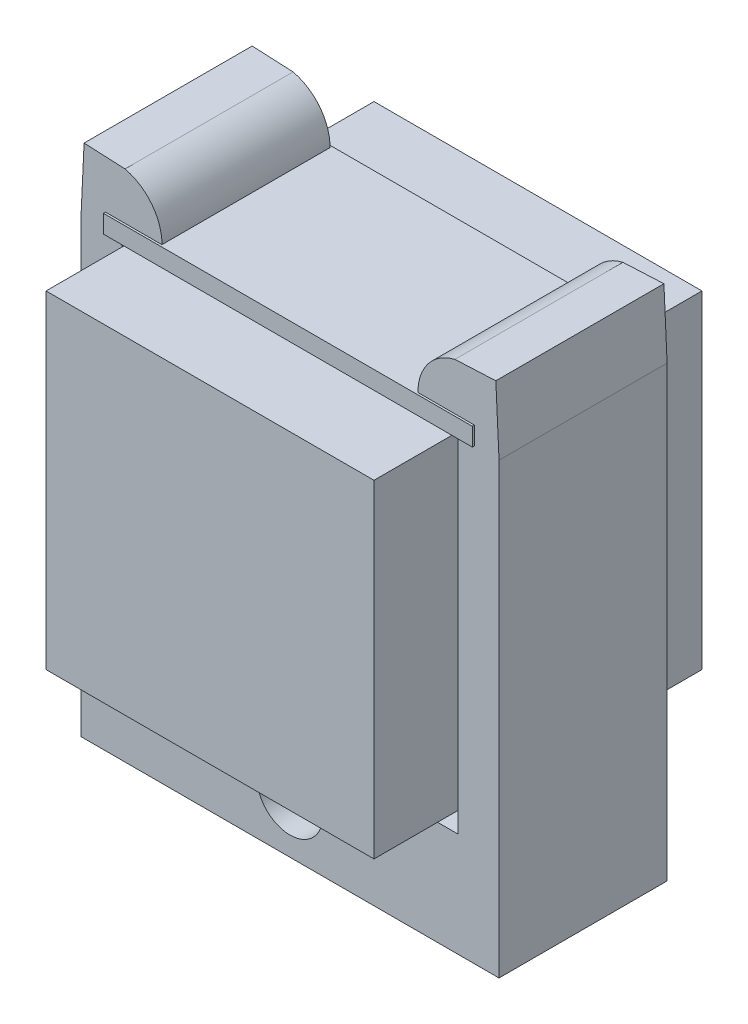
ISO-10303-21;
HEADER;
FILE_DESCRIPTION(('STEP AP214'),'2;1');
FILE_NAME('part.step','',(''),(''),'','','');
FILE_SCHEMA(('AUTOMOTIVE_DESIGN { 1 0 10303 214 1 1 1 1 }'));
ENDSEC;
DATA;
#1=APPLICATION_CONTEXT('core data for automotive mechanical design processes');
#2=APPLICATION_PROTOCOL_DEFINITION('international standard','automotive_design',2000,#1);
#3=PRODUCT_CONTEXT('',#1,'mechanical');
#4=PRODUCT('Part','Part','',(#3));
#5=PRODUCT_RELATED_PRODUCT_CATEGORY('part','',(#4));
#6=PRODUCT_DEFINITION_FORMATION('','',#4);
#7=PRODUCT_DEFINITION_CONTEXT('part definition',#1,'design');
#8=PRODUCT_DEFINITION('design','',#6,#7);
#9=PRODUCT_DEFINITION_SHAPE('','',#8);
#10=(LENGTH_UNIT() NAMED_UNIT(*) SI_UNIT(.MILLI.,.METRE.));
#11=(NAMED_UNIT(*) PLANE_ANGLE_UNIT() SI_UNIT($,.RADIAN.));
#12=(NAMED_UNIT(*) SI_UNIT($,.STERADIAN.) SOLID_ANGLE_UNIT());
#13=UNCERTAINTY_MEASURE_WITH_UNIT(LENGTH_MEASURE(1.E-05),#10,'distance_accuracy_value','');
#14=(GEOMETRIC_REPRESENTATION_CONTEXT(3) GLOBAL_UNCERTAINTY_ASSIGNED_CONTEXT((#13)) GLOBAL_UNIT_ASSIGNED_CONTEXT((#10,
#11,#12)) REPRESENTATION_CONTEXT('',''));
#15=CARTESIAN_POINT('',(0.,0.,0.));
#16=DIRECTION('',(0.,0.,1.));
#17=DIRECTION('',(1.,0.,0.));
#18=AXIS2_PLACEMENT_3D('',#15,#16,#17);
#19=CARTESIAN_POINT('',(-21.4721854815007,2.24878746538494,10.25));
#20=DIRECTION('',(0.,0.,-1.));
#21=DIRECTION('',(-1.,0.,0.));
#22=AXIS2_PLACEMENT_3D('',#19,#20,#21);
#23=CYLINDRICAL_SURFACE('',#22,5.86319672651851);
#24=CARTESIAN_POINT('',(-21.4721854815007,2.24878746538494,-10.25));
#25=DIRECTION('',(0.,0.,1.));
#26=DIRECTION('',(1.,0.,0.));
#27=AXIS2_PLACEMENT_3D('',#24,#25,#26);
#28=CIRCLE('',#27,5.86319672651851);
#29=CARTESIAN_POINT('',(-20.1156250861712,7.95289298226316,-10.25));
#30=VERTEX_POINT('',#29);
#31=CARTESIAN_POINT('',(-15.6156250861712,1.96990363703593,-10.25));
#32=VERTEX_POINT('',#31);
#33=EDGE_CURVE('E200',#30,#32,#28,.F.);
#34=ORIENTED_EDGE('',*,*,#33,.F.);
#35=DIRECTION('',(0.,0.,-1.));
#36=VECTOR('',#35,1.);
#37=CARTESIAN_POINT('',(-20.1156250861712,7.95289298226316,10.25));
#38=LINE('',#37,#36);
#39=CARTESIAN_POINT('',(-20.1156250861712,7.95289298226316,10.25));
#40=VERTEX_POINT('',#39);
#41=EDGE_CURVE('E12',#40,#30,#38,.T.);
#42=ORIENTED_EDGE('',*,*,#41,.F.);
#43=CARTESIAN_POINT('',(-21.4721854815007,2.24878746538494,10.25));
#44=DIRECTION('',(0.,0.,1.));
#45=DIRECTION('',(1.,0.,0.));
#46=AXIS2_PLACEMENT_3D('',#43,#44,#45);
#47=CIRCLE('',#46,5.86319672651851);
#48=CARTESIAN_POINT('',(-15.6156250861712,1.96990363703593,10.25));
#49=VERTEX_POINT('',#48);
#50=EDGE_CURVE('E243',#40,#49,#47,.F.);
#51=ORIENTED_EDGE('',*,*,#50,.T.);
#52=DIRECTION('',(0.,0.,-1.));
#53=VECTOR('',#52,1.);
#54=CARTESIAN_POINT('',(-15.6156250861712,1.96990363703593,10.25));
#55=LINE('',#54,#53);
#56=EDGE_CURVE('E71',#49,#32,#55,.T.);
#57=ORIENTED_EDGE('',*,*,#56,.T.);
#58=EDGE_LOOP('',(#34,#42,#51,#57));
#59=FACE_BOUND('',#58,.T.);
#60=ADVANCED_FACE('F55',(#59),#23,.T.);
#61=CARTESIAN_POINT('',(0.332341917514352,6.97918026780204,10.25));
#62=DIRECTION('',(0.047565149415445,0.998868137724438,0.));
#63=DIRECTION('',(-0.998868137724438,0.0475651494154451,0.));
#64=AXIS2_PLACEMENT_3D('',#61,#62,#63);
#65=PLANE('',#64);
#66=DIRECTION('',(0.998868137724438,-0.0475651494154451,0.));
#67=VECTOR('',#66,1.);
#68=CARTESIAN_POINT('',(0.332341917514352,6.97918026780204,-10.25));
#69=LINE('',#68,#67);
#70=CARTESIAN_POINT('',(-25.1099657747934,8.19071872934039,-10.25));
#71=VERTEX_POINT('',#70);
#72=EDGE_CURVE('E202',#71,#30,#69,.T.);
#73=ORIENTED_EDGE('',*,*,#72,.F.);
#74=DIRECTION('',(0.,0.,-1.));
#75=VECTOR('',#74,1.);
#76=CARTESIAN_POINT('',(-25.1099657747934,8.19071872934039,10.25));
#77=LINE('',#76,#75);
#78=CARTESIAN_POINT('',(-25.1099657747934,8.19071872934039,10.25));
#79=VERTEX_POINT('',#78);
#80=EDGE_CURVE('E63',#79,#71,#77,.T.);
#81=ORIENTED_EDGE('',*,*,#80,.F.);
#82=DIRECTION('',(0.998868137724438,-0.0475651494154451,0.));
#83=VECTOR('',#82,1.);
#84=CARTESIAN_POINT('',(0.332341917514352,6.97918026780204,10.25));
#85=LINE('',#84,#83);
#86=EDGE_CURVE('E294',#79,#40,#85,.T.);
#87=ORIENTED_EDGE('',*,*,#86,.T.);
#88=ORIENTED_EDGE('',*,*,#41,.T.);
#89=EDGE_LOOP('',(#73,#81,#87,#88));
#90=FACE_BOUND('',#89,.T.);
#91=ADVANCED_FACE('F280',(#90),#65,.T.);
#92=CARTESIAN_POINT('',(-25.4423076923077,1.21153846153834,10.25));
#93=DIRECTION('',(-0.998868137724438,0.0475651494154446,0.));
#94=DIRECTION('',(-0.0475651494154446,-0.998868137724438,0.));
#95=AXIS2_PLACEMENT_3D('',#92,#93,#94);
#96=PLANE('',#95);
#97=DIRECTION('',(0.0475651494154446,0.998868137724438,0.));
#98=VECTOR('',#97,1.);
#99=CARTESIAN_POINT('',(-25.4423076923077,1.21153846153834,-10.25));
#100=LINE('',#99,#98);
#101=CARTESIAN_POINT('',(-25.5,0.,-10.25));
#102=VERTEX_POINT('',#101);
#103=EDGE_CURVE('E205',#102,#71,#100,.T.);
#104=ORIENTED_EDGE('',*,*,#103,.F.);
#105=DIRECTION('',(0.,0.,-1.));
#106=VECTOR('',#105,1.);
#107=CARTESIAN_POINT('',(-25.5,0.,10.25));
#108=LINE('',#107,#106);
#109=CARTESIAN_POINT('',(-25.5,0.,10.25));
#110=VERTEX_POINT('',#109);
#111=EDGE_CURVE('E269',#110,#102,#108,.T.);
#112=ORIENTED_EDGE('',*,*,#111,.F.);
#113=DIRECTION('',(0.0475651494154446,0.998868137724438,0.));
#114=VECTOR('',#113,1.);
#115=CARTESIAN_POINT('',(-25.4423076923077,1.21153846153834,10.25));
#116=LINE('',#115,#114);
#117=EDGE_CURVE('E276',#110,#79,#116,.T.);
#118=ORIENTED_EDGE('',*,*,#117,.T.);
#119=ORIENTED_EDGE('',*,*,#80,.T.);
#120=EDGE_LOOP('',(#104,#112,#118,#119));
#121=FACE_BOUND('',#120,.T.);
#122=ADVANCED_FACE('F274',(#121),#96,.T.);
#123=CARTESIAN_POINT('',(-25.5,0.,10.25));
#124=DIRECTION('',(-1.,0.,0.));
#125=DIRECTION('',(0.,0.,1.));
#126=AXIS2_PLACEMENT_3D('',#123,#124,#125);
#127=PLANE('',#126);
#128=DIRECTION('',(0.,1.,0.));
#129=VECTOR('',#128,1.);
#130=CARTESIAN_POINT('',(-25.5,0.,-10.25));
#131=LINE('',#130,#129);
#132=CARTESIAN_POINT('',(-25.5,-54.7,-10.25));
#133=VERTEX_POINT('',#132);
#134=EDGE_CURVE('E208',#133,#102,#131,.T.);
#135=ORIENTED_EDGE('',*,*,#134,.F.);
#136=DIRECTION('',(0.,0.,-1.));
#137=VECTOR('',#136,1.);
#138=CARTESIAN_POINT('',(-25.5,-54.7,10.25));
#139=LINE('',#138,#137);
#140=CARTESIAN_POINT('',(-25.5,-54.7,10.25));
#141=VERTEX_POINT('',#140);
#142=EDGE_CURVE('E267',#141,#133,#139,.T.);
#143=ORIENTED_EDGE('',*,*,#142,.F.);
#144=DIRECTION('',(0.,1.,0.));
#145=VECTOR('',#144,1.);
#146=CARTESIAN_POINT('',(-25.5,0.,10.25));
#147=LINE('',#146,#145);
#148=EDGE_CURVE('E291',#141,#110,#147,.T.);
#149=ORIENTED_EDGE('',*,*,#148,.T.);
#150=ORIENTED_EDGE('',*,*,#111,.T.);
#151=EDGE_LOOP('',(#135,#143,#149,#150));
#152=FACE_BOUND('',#151,.T.);
#153=ADVANCED_FACE('F288',(#152),#127,.T.);
#154=CARTESIAN_POINT('',(0.,-54.7,10.25));
#155=DIRECTION('',(0.,-1.,0.));
#156=DIRECTION('',(0.,0.,-1.));
#157=AXIS2_PLACEMENT_3D('',#154,#155,#156);
#158=PLANE('',#157);
#159=DIRECTION('',(-1.,0.,0.));
#160=VECTOR('',#159,1.);
#161=CARTESIAN_POINT('',(0.,-54.7,-10.25));
#162=LINE('',#161,#160);
#163=CARTESIAN_POINT('',(25.5,-54.7,-10.25));
#164=VERTEX_POINT('',#163);
#165=EDGE_CURVE('E211',#164,#133,#162,.T.);
#166=ORIENTED_EDGE('',*,*,#165,.F.);
#167=DIRECTION('',(0.,0.,-1.));
#168=VECTOR('',#167,1.);
#169=CARTESIAN_POINT('',(25.5,-54.7,10.25));
#170=LINE('',#169,#168);
#171=CARTESIAN_POINT('',(25.5,-54.7,10.25));
#172=VERTEX_POINT('',#171);
#173=EDGE_CURVE('E265',#172,#164,#170,.T.);
#174=ORIENTED_EDGE('',*,*,#173,.F.);
#175=DIRECTION('',(-1.,0.,0.));
#176=VECTOR('',#175,1.);
#177=CARTESIAN_POINT('',(0.,-54.7,10.25));
#178=LINE('',#177,#176);
#179=EDGE_CURVE('E296',#172,#141,#178,.T.);
#180=ORIENTED_EDGE('',*,*,#179,.T.);
#181=ORIENTED_EDGE('',*,*,#142,.T.);
#182=EDGE_LOOP('',(#166,#174,#180,#181));
#183=FACE_BOUND('',#182,.T.);
#184=ADVANCED_FACE('F343',(#183),#158,.T.);
#185=CARTESIAN_POINT('',(25.5,0.,10.25));
#186=DIRECTION('',(-1.,0.,0.));
#187=DIRECTION('',(0.,0.,1.));
#188=AXIS2_PLACEMENT_3D('',#185,#186,#187);
#189=PLANE('',#188);
#190=DIRECTION('',(0.,1.,0.));
#191=VECTOR('',#190,1.);
#192=CARTESIAN_POINT('',(25.5,0.,-10.25));
#193=LINE('',#192,#191);
#194=CARTESIAN_POINT('',(25.5,0.,-10.25));
#195=VERTEX_POINT('',#194);
#196=EDGE_CURVE('E214',#164,#195,#193,.T.);
#197=ORIENTED_EDGE('',*,*,#196,.T.);
#198=DIRECTION('',(0.,0.,-1.));
#199=VECTOR('',#198,1.);
#200=CARTESIAN_POINT('',(25.5,0.,10.25));
#201=LINE('',#200,#199);
#202=CARTESIAN_POINT('',(25.5,0.,10.25));
#203=VERTEX_POINT('',#202);
#204=EDGE_CURVE('E262',#203,#195,#201,.T.);
#205=ORIENTED_EDGE('',*,*,#204,.F.);
#206=DIRECTION('',(0.,1.,0.));
#207=VECTOR('',#206,1.);
#208=CARTESIAN_POINT('',(25.5,0.,10.25));
#209=LINE('',#208,#207);
#210=EDGE_CURVE('E302',#172,#203,#209,.T.);
#211=ORIENTED_EDGE('',*,*,#210,.F.);
#212=ORIENTED_EDGE('',*,*,#173,.T.);
#213=EDGE_LOOP('',(#197,#205,#211,#212));
#214=FACE_BOUND('',#213,.T.);
#215=ADVANCED_FACE('F346',(#214),#189,.F.);
#216=CARTESIAN_POINT('',(25.4423076923077,1.21153846153834,10.25));
#217=DIRECTION('',(-0.998868137724438,-0.0475651494154446,0.));
#218=DIRECTION('',(0.0475651494154446,-0.998868137724438,0.));
#219=AXIS2_PLACEMENT_3D('',#216,#217,#218);
#220=PLANE('',#219);
#221=DIRECTION('',(-0.0475651494154446,0.998868137724438,0.));
#222=VECTOR('',#221,1.);
#223=CARTESIAN_POINT('',(25.4423076923077,1.21153846153834,-10.25));
#224=LINE('',#223,#222);
#225=CARTESIAN_POINT('',(25.1099657747934,8.19071872934039,-10.25));
#226=VERTEX_POINT('',#225);
#227=EDGE_CURVE('E216',#195,#226,#224,.T.);
#228=ORIENTED_EDGE('',*,*,#227,.T.);
#229=DIRECTION('',(0.,0.,-1.));
#230=VECTOR('',#229,1.);
#231=CARTESIAN_POINT('',(25.1099657747934,8.19071872934039,10.25));
#232=LINE('',#231,#230);
#233=CARTESIAN_POINT('',(25.1099657747934,8.19071872934039,10.25));
#234=VERTEX_POINT('',#233);
#235=EDGE_CURVE('E259',#234,#226,#232,.T.);
#236=ORIENTED_EDGE('',*,*,#235,.F.);
#237=DIRECTION('',(-0.0475651494154446,0.998868137724438,0.));
#238=VECTOR('',#237,1.);
#239=CARTESIAN_POINT('',(25.4423076923077,1.21153846153834,10.25));
#240=LINE('',#239,#238);
#241=EDGE_CURVE('E304',#203,#234,#240,.T.);
#242=ORIENTED_EDGE('',*,*,#241,.F.);
#243=ORIENTED_EDGE('',*,*,#204,.T.);
#244=EDGE_LOOP('',(#228,#236,#242,#243));
#245=FACE_BOUND('',#244,.T.);
#246=ADVANCED_FACE('F350',(#245),#220,.F.);
#247=CARTESIAN_POINT('',(-0.332341917514352,6.97918026780204,10.25));
#248=DIRECTION('',(0.047565149415445,-0.998868137724438,0.));
#249=DIRECTION('',(0.998868137724438,0.0475651494154451,0.));
#250=AXIS2_PLACEMENT_3D('',#247,#248,#249);
#251=PLANE('',#250);
#252=DIRECTION('',(-0.998868137724438,-0.0475651494154451,0.));
#253=VECTOR('',#252,1.);
#254=CARTESIAN_POINT('',(-0.332341917514352,6.97918026780204,-10.25));
#255=LINE('',#254,#253);
#256=CARTESIAN_POINT('',(20.1156250861712,7.95289298226316,-10.25));
#257=VERTEX_POINT('',#256);
#258=EDGE_CURVE('E218',#226,#257,#255,.T.);
#259=ORIENTED_EDGE('',*,*,#258,.T.);
#260=DIRECTION('',(0.,0.,-1.));
#261=VECTOR('',#260,1.);
#262=CARTESIAN_POINT('',(20.1156250861712,7.95289298226316,10.25));
#263=LINE('',#262,#261);
#264=CARTESIAN_POINT('',(20.1156250861712,7.95289298226316,10.25));
#265=VERTEX_POINT('',#264);
#266=EDGE_CURVE('E256',#265,#257,#263,.T.);
#267=ORIENTED_EDGE('',*,*,#266,.F.);
#268=DIRECTION('',(-0.998868137724438,-0.0475651494154451,0.));
#269=VECTOR('',#268,1.);
#270=CARTESIAN_POINT('',(-0.332341917514352,6.97918026780204,10.25));
#271=LINE('',#270,#269);
#272=EDGE_CURVE('E306',#234,#265,#271,.T.);
#273=ORIENTED_EDGE('',*,*,#272,.F.);
#274=ORIENTED_EDGE('',*,*,#235,.T.);
#275=EDGE_LOOP('',(#259,#267,#273,#274));
#276=FACE_BOUND('',#275,.T.);
#277=ADVANCED_FACE('F354',(#276),#251,.F.);
#278=CARTESIAN_POINT('',(21.4721854815007,2.24878746538494,10.25));
#279=DIRECTION('',(0.,0.,-1.));
#280=DIRECTION('',(-1.,0.,0.));
#281=AXIS2_PLACEMENT_3D('',#278,#279,#280);
#282=CYLINDRICAL_SURFACE('',#281,5.86319672651851);
#283=CARTESIAN_POINT('',(21.4721854815007,2.24878746538494,-10.25));
#284=DIRECTION('',(0.,0.,1.));
#285=DIRECTION('',(1.,0.,0.));
#286=AXIS2_PLACEMENT_3D('',#283,#284,#285);
#287=CIRCLE('',#286,5.86319672651851);
#288=CARTESIAN_POINT('',(15.6156250861712,1.96990363703593,-10.25));
#289=VERTEX_POINT('',#288);
#290=EDGE_CURVE('E220',#257,#289,#287,.T.);
#291=ORIENTED_EDGE('',*,*,#290,.T.);
#292=DIRECTION('',(0.,0.,-1.));
#293=VECTOR('',#292,1.);
#294=CARTESIAN_POINT('',(15.6156250861712,1.96990363703593,10.25));
#295=LINE('',#294,#293);
#296=CARTESIAN_POINT('',(15.6156250861712,1.96990363703593,10.25));
#297=VERTEX_POINT('',#296);
#298=EDGE_CURVE('E253',#297,#289,#295,.T.);
#299=ORIENTED_EDGE('',*,*,#298,.F.);
#300=CARTESIAN_POINT('',(21.4721854815007,2.24878746538494,10.25));
#301=DIRECTION('',(0.,0.,1.));
#302=DIRECTION('',(1.,0.,0.));
#303=AXIS2_PLACEMENT_3D('',#300,#301,#302);
#304=CIRCLE('',#303,5.86319672651851);
#305=EDGE_CURVE('E308',#265,#297,#304,.T.);
#306=ORIENTED_EDGE('',*,*,#305,.F.);
#307=ORIENTED_EDGE('',*,*,#266,.T.);
#308=EDGE_LOOP('',(#291,#299,#306,#307));
#309=FACE_BOUND('',#308,.T.);
#310=ADVANCED_FACE('F358',(#309),#282,.T.);
#311=CARTESIAN_POINT('',(-0.0582632382162501,1.22352800254136,10.25));
#312=DIRECTION('',(-0.047565149415445,0.998868137724438,0.));
#313=DIRECTION('',(-0.998868137724438,-0.0475651494154451,0.));
#314=AXIS2_PLACEMENT_3D('',#311,#312,#313);
#315=PLANE('',#314);
#316=DIRECTION('',(0.998868137724438,0.047565149415445,0.));
#317=VECTOR('',#316,1.);
#318=CARTESIAN_POINT('',(-0.0582632382162501,1.22352800254136,-10.25));
#319=LINE('',#318,#317);
#320=CARTESIAN_POINT('',(20.395356671286,2.19750990299376,-10.25));
#321=VERTEX_POINT('',#320);
#322=EDGE_CURVE('E222',#289,#321,#319,.T.);
#323=ORIENTED_EDGE('',*,*,#322,.T.);
#324=DIRECTION('',(0.,0.,-1.));
#325=VECTOR('',#324,1.);
#326=CARTESIAN_POINT('',(20.395356671286,2.19750990299376,10.25));
#327=LINE('',#326,#325);
#328=CARTESIAN_POINT('',(20.395356671286,2.19750990299376,10.25));
#329=VERTEX_POINT('',#328);
#330=EDGE_CURVE('E251',#329,#321,#327,.T.);
#331=ORIENTED_EDGE('',*,*,#330,.F.);
#332=DIRECTION('',(0.998868137724438,0.047565149415445,0.));
#333=VECTOR('',#332,1.);
#334=CARTESIAN_POINT('',(-0.0582632382162501,1.22352800254136,10.25));
#335=LINE('',#334,#333);
#336=EDGE_CURVE('E310',#297,#329,#335,.T.);
#337=ORIENTED_EDGE('',*,*,#336,.F.);
#338=ORIENTED_EDGE('',*,*,#298,.T.);
#339=EDGE_LOOP('',(#323,#331,#337,#338));
#340=FACE_BOUND('',#339,.T.);
#341=ADVANCED_FACE('F362',(#340),#315,.F.);
#342=CARTESIAN_POINT('',(20.4536199095023,0.973981900452354,10.25));
#343=DIRECTION('',(-0.998868137724438,-0.0475651494154428,0.));
#344=DIRECTION('',(0.0475651494154428,-0.998868137724438,0.));
#345=AXIS2_PLACEMENT_3D('',#342,#343,#344);
#346=PLANE('',#345);
#347=DIRECTION('',(-0.0475651494154428,0.998868137724438,0.));
#348=VECTOR('',#347,1.);
#349=CARTESIAN_POINT('',(20.4536199095023,0.973981900452354,-10.25));
#350=LINE('',#349,#348);
#351=CARTESIAN_POINT('',(20.5,0.,-10.25));
#352=VERTEX_POINT('',#351);
#353=EDGE_CURVE('E225',#352,#321,#350,.T.);
#354=ORIENTED_EDGE('',*,*,#353,.F.);
#355=DIRECTION('',(0.,0.,-1.));
#356=VECTOR('',#355,1.);
#357=CARTESIAN_POINT('',(20.5,0.,10.25));
#358=LINE('',#357,#356);
#359=CARTESIAN_POINT('',(20.5,0.,10.25));
#360=VERTEX_POINT('',#359);
#361=EDGE_CURVE('E249',#360,#352,#358,.T.);
#362=ORIENTED_EDGE('',*,*,#361,.F.);
#363=DIRECTION('',(-0.0475651494154428,0.998868137724438,0.));
#364=VECTOR('',#363,1.);
#365=CARTESIAN_POINT('',(20.4536199095023,0.973981900452354,10.25));
#366=LINE('',#365,#364);
#367=EDGE_CURVE('E312',#360,#329,#366,.T.);
#368=ORIENTED_EDGE('',*,*,#367,.T.);
#369=ORIENTED_EDGE('',*,*,#330,.T.);
#370=EDGE_LOOP('',(#354,#362,#368,#369));
#371=FACE_BOUND('',#370,.T.);
#372=ADVANCED_FACE('F366',(#371),#346,.T.);
#373=CARTESIAN_POINT('',(20.5,0.,10.25));
#374=DIRECTION('',(-1.,0.,0.));
#375=DIRECTION('',(0.,0.,1.));
#376=AXIS2_PLACEMENT_3D('',#373,#374,#375);
#377=PLANE('',#376);
#378=DIRECTION('',(0.,1.,0.));
#379=VECTOR('',#378,1.);
#380=CARTESIAN_POINT('',(20.5,0.,-10.25));
#381=LINE('',#380,#379);
#382=CARTESIAN_POINT('',(20.5,-42.,-10.25));
#383=VERTEX_POINT('',#382);
#384=EDGE_CURVE('E228',#383,#352,#381,.T.);
#385=ORIENTED_EDGE('',*,*,#384,.F.);
#386=DIRECTION('',(0.,0.,-1.));
#387=VECTOR('',#386,1.);
#388=CARTESIAN_POINT('',(20.5,-42.,10.25));
#389=LINE('',#388,#387);
#390=CARTESIAN_POINT('',(20.5,-42.,10.25));
#391=VERTEX_POINT('',#390);
#392=EDGE_CURVE('E247',#391,#383,#389,.T.);
#393=ORIENTED_EDGE('',*,*,#392,.F.);
#394=DIRECTION('',(0.,1.,0.));
#395=VECTOR('',#394,1.);
#396=CARTESIAN_POINT('',(20.5,0.,10.25));
#397=LINE('',#396,#395);
#398=EDGE_CURVE('E315',#391,#360,#397,.T.);
#399=ORIENTED_EDGE('',*,*,#398,.T.);
#400=ORIENTED_EDGE('',*,*,#361,.T.);
#401=EDGE_LOOP('',(#385,#393,#399,#400));
#402=FACE_BOUND('',#401,.T.);
#403=ADVANCED_FACE('F370',(#402),#377,.T.);
#404=CARTESIAN_POINT('',(0.,-42.,10.25));
#405=DIRECTION('',(0.,1.,0.));
#406=DIRECTION('',(0.,0.,1.));
#407=AXIS2_PLACEMENT_3D('',#404,#405,#406);
#408=PLANE('',#407);
#409=DIRECTION('',(1.,0.,0.));
#410=VECTOR('',#409,1.);
#411=CARTESIAN_POINT('',(0.,-42.,-10.25));
#412=LINE('',#411,#410);
#413=CARTESIAN_POINT('',(-20.5,-42.,-10.25));
#414=VERTEX_POINT('',#413);
#415=EDGE_CURVE('E231',#414,#383,#412,.T.);
#416=ORIENTED_EDGE('',*,*,#415,.F.);
#417=DIRECTION('',(0.,0.,-1.));
#418=VECTOR('',#417,1.);
#419=CARTESIAN_POINT('',(-20.5,-42.,10.25));
#420=LINE('',#419,#418);
#421=CARTESIAN_POINT('',(-20.5,-42.,10.25));
#422=VERTEX_POINT('',#421);
#423=EDGE_CURVE('E189',#422,#414,#420,.T.);
#424=ORIENTED_EDGE('',*,*,#423,.F.);
#425=DIRECTION('',(1.,0.,0.));
#426=VECTOR('',#425,1.);
#427=CARTESIAN_POINT('',(0.,-42.,10.25));
#428=LINE('',#427,#426);
#429=EDGE_CURVE('E179',#422,#391,#428,.T.);
#430=ORIENTED_EDGE('',*,*,#429,.T.);
#431=ORIENTED_EDGE('',*,*,#392,.T.);
#432=EDGE_LOOP('',(#416,#424,#430,#431));
#433=FACE_BOUND('',#432,.T.);
#434=ADVANCED_FACE('F319',(#433),#408,.T.);
#435=CARTESIAN_POINT('',(-20.5,0.,10.25));
#436=DIRECTION('',(-1.,0.,0.));
#437=DIRECTION('',(0.,0.,1.));
#438=AXIS2_PLACEMENT_3D('',#435,#436,#437);
#439=PLANE('',#438);
#440=DIRECTION('',(0.,1.,0.));
#441=VECTOR('',#440,1.);
#442=CARTESIAN_POINT('',(-20.5,0.,-10.25));
#443=LINE('',#442,#441);
#444=CARTESIAN_POINT('',(-20.5,0.,-10.25));
#445=VERTEX_POINT('',#444);
#446=EDGE_CURVE('E186',#414,#445,#443,.T.);
#447=ORIENTED_EDGE('',*,*,#446,.T.);
#448=DIRECTION('',(0.,0.,-1.));
#449=VECTOR('',#448,1.);
#450=CARTESIAN_POINT('',(-20.5,0.,10.25));
#451=LINE('',#450,#449);
#452=CARTESIAN_POINT('',(-20.5,0.,10.25));
#453=VERTEX_POINT('',#452);
#454=EDGE_CURVE('E183',#453,#445,#451,.T.);
#455=ORIENTED_EDGE('',*,*,#454,.F.);
#456=DIRECTION('',(0.,1.,0.));
#457=VECTOR('',#456,1.);
#458=CARTESIAN_POINT('',(-20.5,0.,10.25));
#459=LINE('',#458,#457);
#460=EDGE_CURVE('E170',#422,#453,#459,.T.);
#461=ORIENTED_EDGE('',*,*,#460,.F.);
#462=ORIENTED_EDGE('',*,*,#423,.T.);
#463=EDGE_LOOP('',(#447,#455,#461,#462));
#464=FACE_BOUND('',#463,.T.);
#465=ADVANCED_FACE('F184',(#464),#439,.F.);
#466=CARTESIAN_POINT('',(-20.4536199095023,0.973981900452354,10.25));
#467=DIRECTION('',(-0.998868137724438,0.0475651494154428,0.));
#468=DIRECTION('',(-0.0475651494154428,-0.998868137724438,0.));
#469=AXIS2_PLACEMENT_3D('',#466,#467,#468);
#470=PLANE('',#469);
#471=DIRECTION('',(0.0475651494154428,0.998868137724438,0.));
#472=VECTOR('',#471,1.);
#473=CARTESIAN_POINT('',(-20.4536199095023,0.973981900452354,-10.25));
#474=LINE('',#473,#472);
#475=CARTESIAN_POINT('',(-20.395356671286,2.19750990299376,-10.25));
#476=VERTEX_POINT('',#475);
#477=EDGE_CURVE('E235',#445,#476,#474,.T.);
#478=ORIENTED_EDGE('',*,*,#477,.T.);
#479=DIRECTION('',(0.,0.,-1.));
#480=VECTOR('',#479,1.);
#481=CARTESIAN_POINT('',(-20.395356671286,2.19750990299376,10.25));
#482=LINE('',#481,#480);
#483=CARTESIAN_POINT('',(-20.395356671286,2.19750990299376,10.25));
#484=VERTEX_POINT('',#483);
#485=EDGE_CURVE('E121',#484,#476,#482,.T.);
#486=ORIENTED_EDGE('',*,*,#485,.F.);
#487=DIRECTION('',(0.0475651494154428,0.998868137724438,0.));
#488=VECTOR('',#487,1.);
#489=CARTESIAN_POINT('',(-20.4536199095023,0.973981900452354,10.25));
#490=LINE('',#489,#488);
#491=EDGE_CURVE('E176',#453,#484,#490,.T.);
#492=ORIENTED_EDGE('',*,*,#491,.F.);
#493=ORIENTED_EDGE('',*,*,#454,.T.);
#494=EDGE_LOOP('',(#478,#486,#492,#493));
#495=FACE_BOUND('',#494,.T.);
#496=ADVANCED_FACE('F191',(#495),#470,.F.);
#497=CARTESIAN_POINT('',(0.0582632382162501,1.22352800254136,10.25));
#498=DIRECTION('',(-0.047565149415445,-0.998868137724438,0.));
#499=DIRECTION('',(0.998868137724438,-0.0475651494154451,0.));
#500=AXIS2_PLACEMENT_3D('',#497,#498,#499);
#501=PLANE('',#500);
#502=DIRECTION('',(-0.998868137724438,0.047565149415445,0.));
#503=VECTOR('',#502,1.);
#504=CARTESIAN_POINT('',(0.0582632382162501,1.22352800254136,-10.25));
#505=LINE('',#504,#503);
#506=EDGE_CURVE('E237',#32,#476,#505,.T.);
#507=ORIENTED_EDGE('',*,*,#506,.F.);
#508=ORIENTED_EDGE('',*,*,#56,.F.);
#509=DIRECTION('',(-0.998868137724438,0.047565149415445,0.));
#510=VECTOR('',#509,1.);
#511=CARTESIAN_POINT('',(0.0582632382162501,1.22352800254136,10.25));
#512=LINE('',#511,#510);
#513=EDGE_CURVE('E192',#49,#484,#512,.T.);
#514=ORIENTED_EDGE('',*,*,#513,.T.);
#515=ORIENTED_EDGE('',*,*,#485,.T.);
#516=EDGE_LOOP('',(#507,#508,#514,#515));
#517=FACE_BOUND('',#516,.T.);
#518=ADVANCED_FACE('F321',(#517),#501,.T.);
#519=CARTESIAN_POINT('',(0.,-48.35,10.25));
#520=DIRECTION('',(0.,0.,-1.));
#521=DIRECTION('',(-1.,0.,0.));
#522=AXIS2_PLACEMENT_3D('',#519,#520,#521);
#523=CYLINDRICAL_SURFACE('',#522,4.);
#524=CARTESIAN_POINT('',(0.,-48.35,10.25));
#525=DIRECTION('',(0.,0.,1.));
#526=DIRECTION('',(1.,0.,0.));
#527=AXIS2_PLACEMENT_3D('',#524,#525,#526);
#528=CIRCLE('',#527,4.);
#529=CARTESIAN_POINT('',(4.,-48.35,10.25));
#530=VERTEX_POINT('',#529);
#531=EDGE_CURVE('E194',#530,#530,#528,.T.);
#532=ORIENTED_EDGE('',*,*,#531,.T.);
#533=EDGE_LOOP('',(#532));
#534=FACE_BOUND('',#533,.T.);
#535=CARTESIAN_POINT('',(0.,-48.35,-10.25));
#536=DIRECTION('',(0.,0.,1.));
#537=DIRECTION('',(1.,0.,0.));
#538=AXIS2_PLACEMENT_3D('',#535,#536,#537);
#539=CIRCLE('',#538,4.);
#540=CARTESIAN_POINT('',(4.,-48.35,-10.25));
#541=VERTEX_POINT('',#540);
#542=EDGE_CURVE('E240',#541,#541,#539,.T.);
#543=ORIENTED_EDGE('',*,*,#542,.F.);
#544=EDGE_LOOP('',(#543));
#545=FACE_BOUND('',#544,.T.);
#546=ADVANCED_FACE('F323',(#534,#545),#523,.F.);
#547=CARTESIAN_POINT('',(0.,0.,10.25));
#548=DIRECTION('',(0.,0.,1.));
#549=DIRECTION('',(1.,0.,0.));
#550=AXIS2_PLACEMENT_3D('',#547,#548,#549);
#551=PLANE('',#550);
#552=ORIENTED_EDGE('',*,*,#50,.F.);
#553=ORIENTED_EDGE('',*,*,#86,.F.);
#554=ORIENTED_EDGE('',*,*,#117,.F.);
#555=ORIENTED_EDGE('',*,*,#148,.F.);
#556=ORIENTED_EDGE('',*,*,#179,.F.);
#557=ORIENTED_EDGE('',*,*,#210,.T.);
#558=ORIENTED_EDGE('',*,*,#241,.T.);
#559=ORIENTED_EDGE('',*,*,#272,.T.);
#560=ORIENTED_EDGE('',*,*,#305,.T.);
#561=ORIENTED_EDGE('',*,*,#336,.T.);
#562=ORIENTED_EDGE('',*,*,#367,.F.);
#563=ORIENTED_EDGE('',*,*,#398,.F.);
#564=ORIENTED_EDGE('',*,*,#429,.F.);
#565=ORIENTED_EDGE('',*,*,#460,.T.);
#566=ORIENTED_EDGE('',*,*,#491,.T.);
#567=ORIENTED_EDGE('',*,*,#513,.F.);
#568=EDGE_LOOP('',(#552,#553,#554,#555,#556,#557,#558,#559,#560,#561,#562,#563,#564,#565,#566,#567));
#569=FACE_BOUND('',#568,.T.);
#570=ORIENTED_EDGE('',*,*,#531,.F.);
#571=EDGE_LOOP('',(#570));
#572=FACE_BOUND('',#571,.T.);
#573=ADVANCED_FACE('F172',(#569,#572),#551,.T.);
#574=CARTESIAN_POINT('',(0.,0.,-10.25));
#575=DIRECTION('',(0.,0.,1.));
#576=DIRECTION('',(1.,0.,0.));
#577=AXIS2_PLACEMENT_3D('',#574,#575,#576);
#578=PLANE('',#577);
#579=ORIENTED_EDGE('',*,*,#33,.T.);
#580=ORIENTED_EDGE('',*,*,#506,.T.);
#581=ORIENTED_EDGE('',*,*,#477,.F.);
#582=ORIENTED_EDGE('',*,*,#446,.F.);
#583=ORIENTED_EDGE('',*,*,#415,.T.);
#584=ORIENTED_EDGE('',*,*,#384,.T.);
#585=ORIENTED_EDGE('',*,*,#353,.T.);
#586=ORIENTED_EDGE('',*,*,#322,.F.);
#587=ORIENTED_EDGE('',*,*,#290,.F.);
#588=ORIENTED_EDGE('',*,*,#258,.F.);
#589=ORIENTED_EDGE('',*,*,#227,.F.);
#590=ORIENTED_EDGE('',*,*,#196,.F.);
#591=ORIENTED_EDGE('',*,*,#165,.T.);
#592=ORIENTED_EDGE('',*,*,#134,.T.);
#593=ORIENTED_EDGE('',*,*,#103,.T.);
#594=ORIENTED_EDGE('',*,*,#72,.T.);
#595=EDGE_LOOP('',(#579,#580,#581,#582,#583,#584,#585,#586,#587,#588,#589,#590,#591,#592,#593,#594));
#596=FACE_BOUND('',#595,.T.);
#597=ORIENTED_EDGE('',*,*,#542,.T.);
#598=EDGE_LOOP('',(#597));
#599=FACE_BOUND('',#598,.T.);
#600=ADVANCED_FACE('F282',(#596,#599),#578,.F.);
#601=CLOSED_SHELL('',(#60,#91,#122,#153,#184,#215,#246,#277,#310,#341,#372,#403,#434,#465,#496,
#518,#546,#573,#600));
#602=MANIFOLD_SOLID_BREP('B2',#601);
#603=CARTESIAN_POINT('',(20.,-40.,20.));
#604=DIRECTION('',(1.,0.,0.));
#605=DIRECTION('',(0.,0.,-1.));
#606=AXIS2_PLACEMENT_3D('',#603,#604,#605);
#607=PLANE('',#606);
#608=DIRECTION('',(0.,0.,-1.));
#609=VECTOR('',#608,1.);
#610=CARTESIAN_POINT('',(20.,0.,20.));
#611=LINE('',#610,#609);
#612=CARTESIAN_POINT('',(20.,0.,20.));
#613=VERTEX_POINT('',#612);
#614=CARTESIAN_POINT('',(20.,0.,-20.));
#615=VERTEX_POINT('',#614);
#616=EDGE_CURVE('E653',#613,#615,#611,.T.);
#617=ORIENTED_EDGE('',*,*,#616,.F.);
#618=DIRECTION('',(0.,1.,0.));
#619=VECTOR('',#618,1.);
#620=CARTESIAN_POINT('',(20.,-40.,20.));
#621=LINE('',#620,#619);
#622=CARTESIAN_POINT('',(20.,-40.,20.));
#623=VERTEX_POINT('',#622);
#624=EDGE_CURVE('E53',#623,#613,#621,.T.);
#625=ORIENTED_EDGE('',*,*,#624,.F.);
#626=DIRECTION('',(0.,0.,-1.));
#627=VECTOR('',#626,1.);
#628=CARTESIAN_POINT('',(20.,-40.,20.));
#629=LINE('',#628,#627);
#630=CARTESIAN_POINT('',(20.,-40.,-20.));
#631=VERTEX_POINT('',#630);
#632=EDGE_CURVE('E645',#623,#631,#629,.T.);
#633=ORIENTED_EDGE('',*,*,#632,.T.);
#634=DIRECTION('',(0.,1.,0.));
#635=VECTOR('',#634,1.);
#636=CARTESIAN_POINT('',(20.,-40.,-20.));
#637=LINE('',#636,#635);
#638=EDGE_CURVE('E586',#631,#615,#637,.T.);
#639=ORIENTED_EDGE('',*,*,#638,.T.);
#640=EDGE_LOOP('',(#617,#625,#633,#639));
#641=FACE_BOUND('',#640,.T.);
#642=ADVANCED_FACE('F583',(#641),#607,.T.);
#643=CARTESIAN_POINT('',(-20.,-40.,20.));
#644=DIRECTION('',(0.,0.,1.));
#645=DIRECTION('',(1.,0.,0.));
#646=AXIS2_PLACEMENT_3D('',#643,#644,#645);
#647=PLANE('',#646);
#648=DIRECTION('',(1.,0.,0.));
#649=VECTOR('',#648,1.);
#650=CARTESIAN_POINT('',(-20.,0.,20.));
#651=LINE('',#650,#649);
#652=CARTESIAN_POINT('',(-20.,0.,20.));
#653=VERTEX_POINT('',#652);
#654=EDGE_CURVE('E648',#653,#613,#651,.T.);
#655=ORIENTED_EDGE('',*,*,#654,.F.);
#656=DIRECTION('',(0.,1.,0.));
#657=VECTOR('',#656,1.);
#658=CARTESIAN_POINT('',(-20.,-40.,20.));
#659=LINE('',#658,#657);
#660=CARTESIAN_POINT('',(-20.,-40.,20.));
#661=VERTEX_POINT('',#660);
#662=EDGE_CURVE('E593',#661,#653,#659,.T.);
#663=ORIENTED_EDGE('',*,*,#662,.F.);
#664=DIRECTION('',(1.,0.,0.));
#665=VECTOR('',#664,1.);
#666=CARTESIAN_POINT('',(-20.,-40.,20.));
#667=LINE('',#666,#665);
#668=EDGE_CURVE('E640',#661,#623,#667,.T.);
#669=ORIENTED_EDGE('',*,*,#668,.T.);
#670=ORIENTED_EDGE('',*,*,#624,.T.);
#671=EDGE_LOOP('',(#655,#663,#669,#670));
#672=FACE_BOUND('',#671,.T.);
#673=ADVANCED_FACE('F669',(#672),#647,.T.);
#674=CARTESIAN_POINT('',(-20.,-40.,20.));
#675=DIRECTION('',(-1.,0.,0.));
#676=DIRECTION('',(0.,0.,1.));
#677=AXIS2_PLACEMENT_3D('',#674,#675,#676);
#678=PLANE('',#677);
#679=DIRECTION('',(0.,0.,1.));
#680=VECTOR('',#679,1.);
#681=CARTESIAN_POINT('',(-20.,0.,20.));
#682=LINE('',#681,#680);
#683=CARTESIAN_POINT('',(-20.,0.,-20.));
#684=VERTEX_POINT('',#683);
#685=EDGE_CURVE('E634',#684,#653,#682,.T.);
#686=ORIENTED_EDGE('',*,*,#685,.F.);
#687=DIRECTION('',(0.,1.,0.));
#688=VECTOR('',#687,1.);
#689=CARTESIAN_POINT('',(-20.,-40.,-20.));
#690=LINE('',#689,#688);
#691=CARTESIAN_POINT('',(-20.,-40.,-20.));
#692=VERTEX_POINT('',#691);
#693=EDGE_CURVE('E629',#692,#684,#690,.T.);
#694=ORIENTED_EDGE('',*,*,#693,.F.);
#695=DIRECTION('',(0.,0.,1.));
#696=VECTOR('',#695,1.);
#697=CARTESIAN_POINT('',(-20.,-40.,20.));
#698=LINE('',#697,#696);
#699=EDGE_CURVE('E632',#692,#661,#698,.T.);
#700=ORIENTED_EDGE('',*,*,#699,.T.);
#701=ORIENTED_EDGE('',*,*,#662,.T.);
#702=EDGE_LOOP('',(#686,#694,#700,#701));
#703=FACE_BOUND('',#702,.T.);
#704=ADVANCED_FACE('F631',(#703),#678,.T.);
#705=CARTESIAN_POINT('',(-20.,-40.,-20.));
#706=DIRECTION('',(0.,0.,-1.));
#707=DIRECTION('',(-1.,0.,0.));
#708=AXIS2_PLACEMENT_3D('',#705,#706,#707);
#709=PLANE('',#708);
#710=DIRECTION('',(-1.,0.,0.));
#711=VECTOR('',#710,1.);
#712=CARTESIAN_POINT('',(-20.,0.,-20.));
#713=LINE('',#712,#711);
#714=EDGE_CURVE('E657',#615,#684,#713,.T.);
#715=ORIENTED_EDGE('',*,*,#714,.F.);
#716=ORIENTED_EDGE('',*,*,#638,.F.);
#717=DIRECTION('',(-1.,0.,0.));
#718=VECTOR('',#717,1.);
#719=CARTESIAN_POINT('',(-20.,-40.,-20.));
#720=LINE('',#719,#718);
#721=EDGE_CURVE('E639',#631,#692,#720,.T.);
#722=ORIENTED_EDGE('',*,*,#721,.T.);
#723=ORIENTED_EDGE('',*,*,#693,.T.);
#724=EDGE_LOOP('',(#715,#716,#722,#723));
#725=FACE_BOUND('',#724,.T.);
#726=ADVANCED_FACE('F643',(#725),#709,.T.);
#727=CARTESIAN_POINT('',(0.,-40.,0.));
#728=DIRECTION('',(0.,-1.,0.));
#729=DIRECTION('',(0.,0.,-1.));
#730=AXIS2_PLACEMENT_3D('',#727,#728,#729);
#731=PLANE('',#730);
#732=ORIENTED_EDGE('',*,*,#632,.F.);
#733=ORIENTED_EDGE('',*,*,#668,.F.);
#734=ORIENTED_EDGE('',*,*,#699,.F.);
#735=ORIENTED_EDGE('',*,*,#721,.F.);
#736=EDGE_LOOP('',(#732,#733,#734,#735));
#737=FACE_BOUND('',#736,.T.);
#738=ADVANCED_FACE('F638',(#737),#731,.T.);
#739=CARTESIAN_POINT('',(0.,0.,0.));
#740=DIRECTION('',(0.,-1.,0.));
#741=DIRECTION('',(0.,0.,-1.));
#742=AXIS2_PLACEMENT_3D('',#739,#740,#741);
#743=PLANE('',#742);
#744=ORIENTED_EDGE('',*,*,#616,.T.);
#745=ORIENTED_EDGE('',*,*,#714,.T.);
#746=ORIENTED_EDGE('',*,*,#685,.T.);
#747=ORIENTED_EDGE('',*,*,#654,.T.);
#748=EDGE_LOOP('',(#744,#745,#746,#747));
#749=FACE_BOUND('',#748,.T.);
#750=ADVANCED_FACE('F668',(#749),#743,.F.);
#751=CLOSED_SHELL('',(#642,#673,#704,#726,#738,#750));
#752=MANIFOLD_SOLID_BREP('B6',#751);
#753=CARTESIAN_POINT('',(22.5,2.2,10.5));
#754=DIRECTION('',(-1.,0.,0.));
#755=DIRECTION('',(0.,0.,1.));
#756=AXIS2_PLACEMENT_3D('',#753,#754,#755);
#757=PLANE('',#756);
#758=DIRECTION('',(0.,0.,-1.));
#759=VECTOR('',#758,1.);
#760=CARTESIAN_POINT('',(22.5,0.,10.5));
#761=LINE('',#760,#759);
#762=CARTESIAN_POINT('',(22.5,0.,10.5));
#763=VERTEX_POINT('',#762);
#764=CARTESIAN_POINT('',(22.5,0.,-10.5));
#765=VERTEX_POINT('',#764);
#766=EDGE_CURVE('E793',#763,#765,#761,.T.);
#767=ORIENTED_EDGE('',*,*,#766,.T.);
#768=DIRECTION('',(0.,-1.,0.));
#769=VECTOR('',#768,1.);
#770=CARTESIAN_POINT('',(22.5,2.2,-10.5));
#771=LINE('',#770,#769);
#772=CARTESIAN_POINT('',(22.5,2.2,-10.5));
#773=VERTEX_POINT('',#772);
#774=EDGE_CURVE('E581',#773,#765,#771,.T.);
#775=ORIENTED_EDGE('',*,*,#774,.F.);
#776=DIRECTION('',(0.,0.,-1.));
#777=VECTOR('',#776,1.);
#778=CARTESIAN_POINT('',(22.5,2.2,10.5));
#779=LINE('',#778,#777);
#780=CARTESIAN_POINT('',(22.5,2.2,10.5));
#781=VERTEX_POINT('',#780);
#782=EDGE_CURVE('E781',#781,#773,#779,.T.);
#783=ORIENTED_EDGE('',*,*,#782,.F.);
#784=DIRECTION('',(0.,-1.,0.));
#785=VECTOR('',#784,1.);
#786=CARTESIAN_POINT('',(22.5,2.2,10.5));
#787=LINE('',#786,#785);
#788=EDGE_CURVE('E789',#781,#763,#787,.T.);
#789=ORIENTED_EDGE('',*,*,#788,.T.);
#790=EDGE_LOOP('',(#767,#775,#783,#789));
#791=FACE_BOUND('',#790,.T.);
#792=ADVANCED_FACE('F730',(#791),#757,.F.);
#793=CARTESIAN_POINT('',(-22.5,2.2,-10.5));
#794=DIRECTION('',(0.,0.,1.));
#795=DIRECTION('',(1.,0.,0.));
#796=AXIS2_PLACEMENT_3D('',#793,#794,#795);
#797=PLANE('',#796);
#798=DIRECTION('',(-1.,0.,0.));
#799=VECTOR('',#798,1.);
#800=CARTESIAN_POINT('',(-22.5,0.,-10.5));
#801=LINE('',#800,#799);
#802=CARTESIAN_POINT('',(-22.5,0.,-10.5));
#803=VERTEX_POINT('',#802);
#804=EDGE_CURVE('E785',#765,#803,#801,.T.);
#805=ORIENTED_EDGE('',*,*,#804,.T.);
#806=DIRECTION('',(0.,-1.,0.));
#807=VECTOR('',#806,1.);
#808=CARTESIAN_POINT('',(-22.5,2.2,-10.5));
#809=LINE('',#808,#807);
#810=CARTESIAN_POINT('',(-22.5,2.2,-10.5));
#811=VERTEX_POINT('',#810);
#812=EDGE_CURVE('E738',#811,#803,#809,.T.);
#813=ORIENTED_EDGE('',*,*,#812,.F.);
#814=DIRECTION('',(-1.,0.,0.));
#815=VECTOR('',#814,1.);
#816=CARTESIAN_POINT('',(-22.5,2.2,-10.5));
#817=LINE('',#816,#815);
#818=EDGE_CURVE('E776',#773,#811,#817,.T.);
#819=ORIENTED_EDGE('',*,*,#818,.F.);
#820=ORIENTED_EDGE('',*,*,#774,.T.);
#821=EDGE_LOOP('',(#805,#813,#819,#820));
#822=FACE_BOUND('',#821,.T.);
#823=ADVANCED_FACE('F784',(#822),#797,.F.);
#824=CARTESIAN_POINT('',(-22.5,2.2,10.5));
#825=DIRECTION('',(1.,0.,0.));
#826=DIRECTION('',(0.,0.,-1.));
#827=AXIS2_PLACEMENT_3D('',#824,#825,#826);
#828=PLANE('',#827);
#829=DIRECTION('',(0.,0.,1.));
#830=VECTOR('',#829,1.);
#831=CARTESIAN_POINT('',(-22.5,0.,10.5));
#832=LINE('',#831,#830);
#833=CARTESIAN_POINT('',(-22.5,0.,10.5));
#834=VERTEX_POINT('',#833);
#835=EDGE_CURVE('E763',#803,#834,#832,.T.);
#836=ORIENTED_EDGE('',*,*,#835,.T.);
#837=DIRECTION('',(0.,-1.,0.));
#838=VECTOR('',#837,1.);
#839=CARTESIAN_POINT('',(-22.5,2.2,10.5));
#840=LINE('',#839,#838);
#841=CARTESIAN_POINT('',(-22.5,2.2,10.5));
#842=VERTEX_POINT('',#841);
#843=EDGE_CURVE('E786',#842,#834,#840,.T.);
#844=ORIENTED_EDGE('',*,*,#843,.F.);
#845=DIRECTION('',(0.,0.,1.));
#846=VECTOR('',#845,1.);
#847=CARTESIAN_POINT('',(-22.5,2.2,10.5));
#848=LINE('',#847,#846);
#849=EDGE_CURVE('E779',#811,#842,#848,.T.);
#850=ORIENTED_EDGE('',*,*,#849,.F.);
#851=ORIENTED_EDGE('',*,*,#812,.T.);
#852=EDGE_LOOP('',(#836,#844,#850,#851));
#853=FACE_BOUND('',#852,.T.);
#854=ADVANCED_FACE('F787',(#853),#828,.F.);
#855=CARTESIAN_POINT('',(-22.5,2.2,10.5));
#856=DIRECTION('',(0.,0.,-1.));
#857=DIRECTION('',(-1.,0.,0.));
#858=AXIS2_PLACEMENT_3D('',#855,#856,#857);
#859=PLANE('',#858);
#860=DIRECTION('',(1.,0.,0.));
#861=VECTOR('',#860,1.);
#862=CARTESIAN_POINT('',(-22.5,0.,10.5));
#863=LINE('',#862,#861);
#864=EDGE_CURVE('E769',#834,#763,#863,.T.);
#865=ORIENTED_EDGE('',*,*,#864,.T.);
#866=ORIENTED_EDGE('',*,*,#788,.F.);
#867=DIRECTION('',(1.,0.,0.));
#868=VECTOR('',#867,1.);
#869=CARTESIAN_POINT('',(-22.5,2.2,10.5));
#870=LINE('',#869,#868);
#871=EDGE_CURVE('E746',#842,#781,#870,.T.);
#872=ORIENTED_EDGE('',*,*,#871,.F.);
#873=ORIENTED_EDGE('',*,*,#843,.T.);
#874=EDGE_LOOP('',(#865,#866,#872,#873));
#875=FACE_BOUND('',#874,.T.);
#876=ADVANCED_FACE('F800',(#875),#859,.F.);
#877=CARTESIAN_POINT('',(0.,2.2,0.));
#878=DIRECTION('',(0.,-1.,0.));
#879=DIRECTION('',(0.,0.,-1.));
#880=AXIS2_PLACEMENT_3D('',#877,#878,#879);
#881=PLANE('',#880);
#882=ORIENTED_EDGE('',*,*,#782,.T.);
#883=ORIENTED_EDGE('',*,*,#818,.T.);
#884=ORIENTED_EDGE('',*,*,#849,.T.);
#885=ORIENTED_EDGE('',*,*,#871,.T.);
#886=EDGE_LOOP('',(#882,#883,#884,#885));
#887=FACE_BOUND('',#886,.T.);
#888=ADVANCED_FACE('F777',(#887),#881,.F.);
#889=CARTESIAN_POINT('',(0.,0.,0.));
#890=DIRECTION('',(0.,-1.,0.));
#891=DIRECTION('',(0.,0.,-1.));
#892=AXIS2_PLACEMENT_3D('',#889,#890,#891);
#893=PLANE('',#892);
#894=ORIENTED_EDGE('',*,*,#766,.F.);
#895=ORIENTED_EDGE('',*,*,#864,.F.);
#896=ORIENTED_EDGE('',*,*,#835,.F.);
#897=ORIENTED_EDGE('',*,*,#804,.F.);
#898=EDGE_LOOP('',(#894,#895,#896,#897));
#899=FACE_BOUND('',#898,.T.);
#900=ADVANCED_FACE('F803',(#899),#893,.T.);
#901=CLOSED_SHELL('',(#792,#823,#854,#876,#888,#900));
#902=MANIFOLD_SOLID_BREP('B47',#901);
#903=ADVANCED_BREP_SHAPE_REPRESENTATION('',(#18,#602,#752,#902),#14);
#904=SHAPE_DEFINITION_REPRESENTATION(#9,#903);
ENDSEC;
END-ISO-10303-21;
